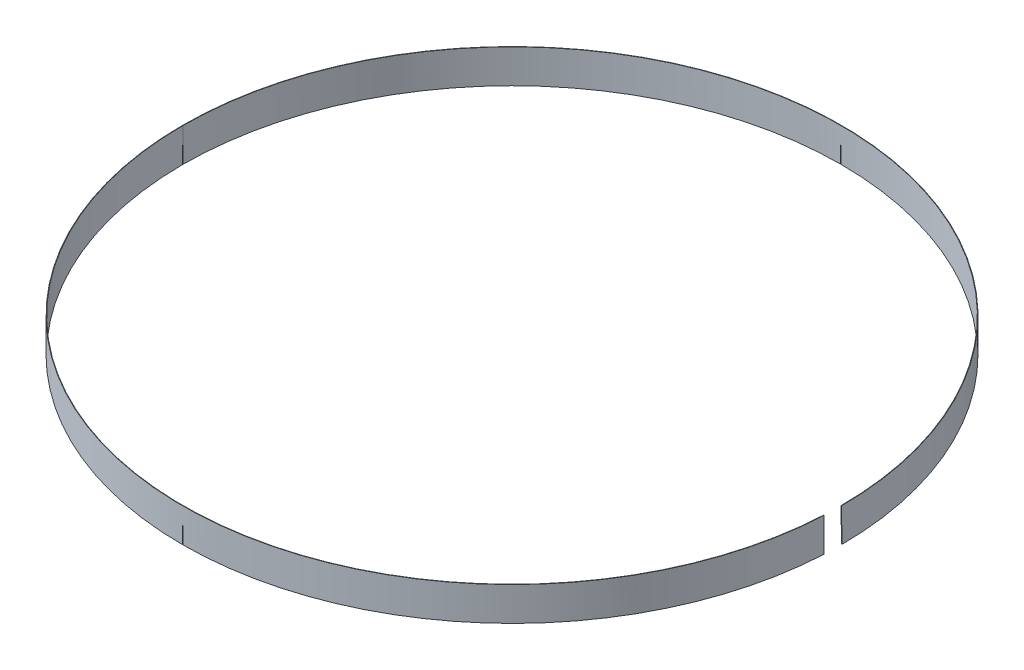
ISO-10303-21;
HEADER;
FILE_DESCRIPTION(('STEP AP214'),'2;1');
FILE_NAME('part.step','',(''),(''),'','','');
FILE_SCHEMA(('AUTOMOTIVE_DESIGN { 1 0 10303 214 1 1 1 1 }'));
ENDSEC;
DATA;
#1=APPLICATION_CONTEXT('core data for automotive mechanical design processes');
#2=APPLICATION_PROTOCOL_DEFINITION('international standard','automotive_design',2000,#1);
#3=PRODUCT_CONTEXT('',#1,'mechanical');
#4=PRODUCT('Part','Part','',(#3));
#5=PRODUCT_RELATED_PRODUCT_CATEGORY('part','',(#4));
#6=PRODUCT_DEFINITION_FORMATION('','',#4);
#7=PRODUCT_DEFINITION_CONTEXT('part definition',#1,'design');
#8=PRODUCT_DEFINITION('design','',#6,#7);
#9=PRODUCT_DEFINITION_SHAPE('','',#8);
#10=(LENGTH_UNIT() NAMED_UNIT(*) SI_UNIT(.MILLI.,.METRE.));
#11=(NAMED_UNIT(*) PLANE_ANGLE_UNIT() SI_UNIT($,.RADIAN.));
#12=(NAMED_UNIT(*) SI_UNIT($,.STERADIAN.) SOLID_ANGLE_UNIT());
#13=UNCERTAINTY_MEASURE_WITH_UNIT(LENGTH_MEASURE(1.E-05),#10,'distance_accuracy_value','');
#14=(GEOMETRIC_REPRESENTATION_CONTEXT(3) GLOBAL_UNCERTAINTY_ASSIGNED_CONTEXT((#13)) GLOBAL_UNIT_ASSIGNED_CONTEXT((#10,
#11,#12)) REPRESENTATION_CONTEXT('',''));
#15=CARTESIAN_POINT('',(0.,0.,0.));
#16=DIRECTION('',(0.,0.,1.));
#17=DIRECTION('',(1.,0.,0.));
#18=AXIS2_PLACEMENT_3D('',#15,#16,#17);
#19=CARTESIAN_POINT('',(195.5,15.,0.));
#20=DIRECTION('',(0.,0.,-1.));
#21=DIRECTION('',(0.,1.,0.));
#22=AXIS2_PLACEMENT_3D('',#19,#20,#21);
#23=PLANE('',#22);
#24=DIRECTION('',(-1.,0.,0.));
#25=VECTOR('',#24,1.);
#26=CARTESIAN_POINT('',(195.5,10.,0.));
#27=LINE('',#26,#25);
#28=CARTESIAN_POINT('',(195.75,10.,0.));
#29=VERTEX_POINT('',#28);
#30=CARTESIAN_POINT('',(195.5,10.,0.));
#31=VERTEX_POINT('',#30);
#32=EDGE_CURVE('E109',#29,#31,#27,.T.);
#33=ORIENTED_EDGE('',*,*,#32,.F.);
#34=DIRECTION('',(0.,-1.,0.));
#35=VECTOR('',#34,1.);
#36=CARTESIAN_POINT('',(195.75,629.899456202727,0.));
#37=LINE('',#36,#35);
#38=CARTESIAN_POINT('',(195.75,20.,0.));
#39=VERTEX_POINT('',#38);
#40=EDGE_CURVE('E284',#29,#39,#37,.F.);
#41=ORIENTED_EDGE('',*,*,#40,.T.);
#42=DIRECTION('',(-1.,0.,0.));
#43=VECTOR('',#42,1.);
#44=CARTESIAN_POINT('',(195.5,20.,0.));
#45=LINE('',#44,#43);
#46=CARTESIAN_POINT('',(195.5,20.,0.));
#47=VERTEX_POINT('',#46);
#48=EDGE_CURVE('E59',#39,#47,#45,.T.);
#49=ORIENTED_EDGE('',*,*,#48,.T.);
#50=DIRECTION('',(0.,1.,0.));
#51=VECTOR('',#50,1.);
#52=CARTESIAN_POINT('',(195.5,10.,0.));
#53=LINE('',#52,#51);
#54=EDGE_CURVE('E234',#31,#47,#53,.T.);
#55=ORIENTED_EDGE('',*,*,#54,.F.);
#56=EDGE_LOOP('',(#33,#41,#49,#55));
#57=FACE_BOUND('',#56,.T.);
#58=ADVANCED_FACE('F40',(#57),#23,.F.);
#59=CARTESIAN_POINT('',(0.,10.,0.));
#60=DIRECTION('',(0.,1.,0.));
#61=DIRECTION('',(0.,0.,1.));
#62=AXIS2_PLACEMENT_3D('',#59,#60,#61);
#63=PLANE('',#62);
#64=DIRECTION('',(-0.999998824118064,0.,0.00153354572478864));
#65=VECTOR('',#64,1.);
#66=CARTESIAN_POINT('',(195.499770115081,10.,-0.299808189196199));
#67=LINE('',#66,#65);
#68=CARTESIAN_POINT('',(195.749769821111,10.,-0.300191575627417));
#69=VERTEX_POINT('',#68);
#70=CARTESIAN_POINT('',(195.499770115081,10.,-0.299808189196199));
#71=VERTEX_POINT('',#70);
#72=EDGE_CURVE('E275',#69,#71,#67,.T.);
#73=ORIENTED_EDGE('',*,*,#72,.F.);
#74=CARTESIAN_POINT('',(0.,10.,0.));
#75=DIRECTION('',(0.,-1.,0.));
#76=DIRECTION('',(0.,0.,-1.));
#77=AXIS2_PLACEMENT_3D('',#74,#75,#76);
#78=CIRCLE('',#77,195.75);
#79=EDGE_CURVE('E281',#69,#29,#78,.T.);
#80=ORIENTED_EDGE('',*,*,#79,.T.);
#81=ORIENTED_EDGE('',*,*,#32,.T.);
#82=CARTESIAN_POINT('',(0.,10.,0.));
#83=DIRECTION('',(0.,-1.,0.));
#84=DIRECTION('',(0.,0.,-1.));
#85=AXIS2_PLACEMENT_3D('',#82,#83,#84);
#86=CIRCLE('',#85,195.5);
#87=EDGE_CURVE('E237',#71,#31,#86,.T.);
#88=ORIENTED_EDGE('',*,*,#87,.F.);
#89=EDGE_LOOP('',(#73,#80,#81,#88));
#90=FACE_BOUND('',#89,.T.);
#91=ADVANCED_FACE('F404',(#90),#63,.F.);
#92=CARTESIAN_POINT('',(195.499770115081,5.,-0.299808189196201));
#93=DIRECTION('',(-0.00153354572478865,0.,-0.999998824118064));
#94=DIRECTION('',(0.,1.,0.));
#95=AXIS2_PLACEMENT_3D('',#92,#93,#94);
#96=PLANE('',#95);
#97=DIRECTION('',(-0.999998824118064,0.,0.00153354572478919));
#98=VECTOR('',#97,1.);
#99=CARTESIAN_POINT('',(195.499770115081,0.,-0.299808189196307));
#100=LINE('',#99,#98);
#101=CARTESIAN_POINT('',(195.749769821111,0.,-0.300191575627417));
#102=VERTEX_POINT('',#101);
#103=CARTESIAN_POINT('',(195.499770115081,0.,-0.299808189196307));
#104=VERTEX_POINT('',#103);
#105=EDGE_CURVE('E270',#102,#104,#100,.T.);
#106=ORIENTED_EDGE('',*,*,#105,.F.);
#107=DIRECTION('',(0.,-1.,0.));
#108=VECTOR('',#107,1.);
#109=CARTESIAN_POINT('',(195.749769821111,629.899456202727,-0.300191575627417));
#110=LINE('',#109,#108);
#111=EDGE_CURVE('E277',#102,#69,#110,.F.);
#112=ORIENTED_EDGE('',*,*,#111,.T.);
#113=ORIENTED_EDGE('',*,*,#72,.T.);
#114=DIRECTION('',(0.,1.,0.));
#115=VECTOR('',#114,1.);
#116=CARTESIAN_POINT('',(195.499770115081,0.,-0.299808189196203));
#117=LINE('',#116,#115);
#118=EDGE_CURVE('E240',#104,#71,#117,.T.);
#119=ORIENTED_EDGE('',*,*,#118,.F.);
#120=EDGE_LOOP('',(#106,#112,#113,#119));
#121=FACE_BOUND('',#120,.T.);
#122=ADVANCED_FACE('F409',(#121),#96,.F.);
#123=CARTESIAN_POINT('',(0.,0.,0.));
#124=DIRECTION('',(0.,1.,0.));
#125=DIRECTION('',(0.,0.,1.));
#126=AXIS2_PLACEMENT_3D('',#123,#124,#125);
#127=PLANE('',#126);
#128=DIRECTION('',(1.51748025478114E-05,0.,0.999999999884863));
#129=VECTOR('',#128,1.);
#130=CARTESIAN_POINT('',(-0.00296667389809713,0.,-195.499999977491));
#131=LINE('',#130,#129);
#132=CARTESIAN_POINT('',(-0.002970467598853,0.,-195.749999977462));
#133=VERTEX_POINT('',#132);
#134=CARTESIAN_POINT('',(-0.00296667389809713,0.,-195.499999977491));
#135=VERTEX_POINT('',#134);
#136=EDGE_CURVE('E265',#133,#135,#131,.T.);
#137=ORIENTED_EDGE('',*,*,#136,.F.);
#138=CARTESIAN_POINT('',(0.,0.,0.));
#139=DIRECTION('',(0.,-1.,0.));
#140=DIRECTION('',(0.,0.,-1.));
#141=AXIS2_PLACEMENT_3D('',#138,#139,#140);
#142=CIRCLE('',#141,195.75);
#143=EDGE_CURVE('E272',#133,#102,#142,.T.);
#144=ORIENTED_EDGE('',*,*,#143,.T.);
#145=ORIENTED_EDGE('',*,*,#105,.T.);
#146=CARTESIAN_POINT('',(0.,0.,0.));
#147=DIRECTION('',(0.,-1.,0.));
#148=DIRECTION('',(0.,0.,-1.));
#149=AXIS2_PLACEMENT_3D('',#146,#147,#148);
#150=CIRCLE('',#149,195.5);
#151=EDGE_CURVE('E243',#135,#104,#150,.T.);
#152=ORIENTED_EDGE('',*,*,#151,.F.);
#153=EDGE_LOOP('',(#137,#144,#145,#152));
#154=FACE_BOUND('',#153,.T.);
#155=ADVANCED_FACE('F416',(#154),#127,.F.);
#156=CARTESIAN_POINT('',(-0.00296667389809713,5.,-195.499999977491));
#157=DIRECTION('',(0.999999999884863,0.,-1.51748025478114E-05));
#158=DIRECTION('',(0.,-1.,0.));
#159=AXIS2_PLACEMENT_3D('',#156,#157,#158);
#160=PLANE('',#159);
#161=DIRECTION('',(1.51748025478114E-05,0.,0.999999999884863));
#162=VECTOR('',#161,1.);
#163=CARTESIAN_POINT('',(-0.00296667389809713,10.,-195.499999977491));
#164=LINE('',#163,#162);
#165=CARTESIAN_POINT('',(-0.002970467598853,10.,-195.749999977462));
#166=VERTEX_POINT('',#165);
#167=CARTESIAN_POINT('',(-0.00296667389809713,10.,-195.499999977491));
#168=VERTEX_POINT('',#167);
#169=EDGE_CURVE('E260',#166,#168,#164,.T.);
#170=ORIENTED_EDGE('',*,*,#169,.F.);
#171=DIRECTION('',(0.,-1.,0.));
#172=VECTOR('',#171,1.);
#173=CARTESIAN_POINT('',(-0.002970467598853,629.899456202727,-195.749999977462));
#174=LINE('',#173,#172);
#175=EDGE_CURVE('E267',#166,#133,#174,.T.);
#176=ORIENTED_EDGE('',*,*,#175,.T.);
#177=ORIENTED_EDGE('',*,*,#136,.T.);
#178=DIRECTION('',(0.,-1.,0.));
#179=VECTOR('',#178,1.);
#180=CARTESIAN_POINT('',(-0.00296667389809713,10.,-195.499999977491));
#181=LINE('',#180,#179);
#182=EDGE_CURVE('E246',#168,#135,#181,.T.);
#183=ORIENTED_EDGE('',*,*,#182,.F.);
#184=EDGE_LOOP('',(#170,#176,#177,#183));
#185=FACE_BOUND('',#184,.T.);
#186=ADVANCED_FACE('F420',(#185),#160,.F.);
#187=CARTESIAN_POINT('',(0.,10.,0.));
#188=DIRECTION('',(0.,1.,0.));
#189=DIRECTION('',(0.,0.,1.));
#190=AXIS2_PLACEMENT_3D('',#187,#188,#189);
#191=PLANE('',#190);
#192=CARTESIAN_POINT('',(0.,10.,0.));
#193=DIRECTION('',(0.,-1.,0.));
#194=DIRECTION('',(0.,0.,-1.));
#195=AXIS2_PLACEMENT_3D('',#192,#193,#194);
#196=CIRCLE('',#195,195.75);
#197=CARTESIAN_POINT('',(-0.303162039698669,10.,-195.749765243225));
#198=VERTEX_POINT('',#197);
#199=EDGE_CURVE('E262',#198,#166,#196,.T.);
#200=ORIENTED_EDGE('',*,*,#199,.T.);
#201=ORIENTED_EDGE('',*,*,#169,.T.);
#202=CARTESIAN_POINT('',(0.,10.,0.));
#203=DIRECTION('',(0.,-1.,0.));
#204=DIRECTION('',(0.,0.,-1.));
#205=AXIS2_PLACEMENT_3D('',#202,#203,#204);
#206=CIRCLE('',#205,195.5);
#207=CARTESIAN_POINT('',(-0.302774859571364,10.,-195.499765543042));
#208=VERTEX_POINT('',#207);
#209=EDGE_CURVE('E249',#208,#168,#206,.T.);
#210=ORIENTED_EDGE('',*,*,#209,.F.);
#211=DIRECTION('',(0.00154872050931644,0.,0.999998800731673));
#212=VECTOR('',#211,1.);
#213=CARTESIAN_POINT('',(-0.302774859571364,10.,-195.499765543042));
#214=LINE('',#213,#212);
#215=EDGE_CURVE('E255',#198,#208,#214,.T.);
#216=ORIENTED_EDGE('',*,*,#215,.F.);
#217=EDGE_LOOP('',(#200,#201,#210,#216));
#218=FACE_BOUND('',#217,.T.);
#219=ADVANCED_FACE('F424',(#218),#191,.F.);
#220=CARTESIAN_POINT('',(-0.302774859571364,5.,-195.499765543042));
#221=DIRECTION('',(-0.999998800731673,0.,0.00154872050931644));
#222=DIRECTION('',(0.,1.,0.));
#223=AXIS2_PLACEMENT_3D('',#220,#221,#222);
#224=PLANE('',#223);
#225=DIRECTION('',(0.00154872050931632,0.,0.999998800731673));
#226=VECTOR('',#225,1.);
#227=CARTESIAN_POINT('',(-0.30277485957134,0.,-195.499765543042));
#228=LINE('',#227,#226);
#229=CARTESIAN_POINT('',(-0.303162039698669,0.,-195.749765243225));
#230=VERTEX_POINT('',#229);
#231=CARTESIAN_POINT('',(-0.30277485957134,0.,-195.499765543042));
#232=VERTEX_POINT('',#231);
#233=EDGE_CURVE('E217',#230,#232,#228,.T.);
#234=ORIENTED_EDGE('',*,*,#233,.F.);
#235=DIRECTION('',(0.,-1.,0.));
#236=VECTOR('',#235,1.);
#237=CARTESIAN_POINT('',(-0.303162039698669,629.899456202727,-195.749765243225));
#238=LINE('',#237,#236);
#239=EDGE_CURVE('E257',#230,#198,#238,.F.);
#240=ORIENTED_EDGE('',*,*,#239,.T.);
#241=ORIENTED_EDGE('',*,*,#215,.T.);
#242=DIRECTION('',(0.,1.,0.));
#243=VECTOR('',#242,1.);
#244=CARTESIAN_POINT('',(-0.302774859571364,0.,-195.499765543042));
#245=LINE('',#244,#243);
#246=EDGE_CURVE('E252',#232,#208,#245,.T.);
#247=ORIENTED_EDGE('',*,*,#246,.F.);
#248=EDGE_LOOP('',(#234,#240,#241,#247));
#249=FACE_BOUND('',#248,.T.);
#250=ADVANCED_FACE('F428',(#249),#224,.F.);
#251=CARTESIAN_POINT('',(0.,629.899456202727,0.));
#252=DIRECTION('',(0.,-1.,0.));
#253=DIRECTION('',(0.,0.,-1.));
#254=AXIS2_PLACEMENT_3D('',#251,#252,#253);
#255=CYLINDRICAL_SURFACE('',#254,195.5);
#256=ORIENTED_EDGE('',*,*,#246,.T.);
#257=ORIENTED_EDGE('',*,*,#209,.T.);
#258=ORIENTED_EDGE('',*,*,#182,.T.);
#259=ORIENTED_EDGE('',*,*,#151,.T.);
#260=ORIENTED_EDGE('',*,*,#118,.T.);
#261=ORIENTED_EDGE('',*,*,#87,.T.);
#262=ORIENTED_EDGE('',*,*,#54,.T.);
#263=CARTESIAN_POINT('',(0.,20.,0.));
#264=DIRECTION('',(0.,1.,0.));
#265=DIRECTION('',(0.,0.,1.));
#266=AXIS2_PLACEMENT_3D('',#263,#264,#265);
#267=CIRCLE('',#266,195.5);
#268=CARTESIAN_POINT('',(-195.5,20.0000000000002,1.33188500793896E-12));
#269=VERTEX_POINT('',#268);
#270=EDGE_CURVE('E231',#47,#269,#267,.T.);
#271=ORIENTED_EDGE('',*,*,#270,.T.);
#272=DIRECTION('',(0.,-1.,0.));
#273=VECTOR('',#272,1.);
#274=CARTESIAN_POINT('',(-195.5,20.,-2.99760216648792E-12));
#275=LINE('',#274,#273);
#276=CARTESIAN_POINT('',(-195.5,2.22044604925031E-13,-1.52917109022532E-12));
#277=VERTEX_POINT('',#276);
#278=EDGE_CURVE('E228',#269,#277,#275,.T.);
#279=ORIENTED_EDGE('',*,*,#278,.T.);
#280=CARTESIAN_POINT('',(0.,0.,0.));
#281=DIRECTION('',(0.,-1.,0.));
#282=DIRECTION('',(0.,0.,-1.));
#283=AXIS2_PLACEMENT_3D('',#280,#281,#282);
#284=CIRCLE('',#283,195.5);
#285=EDGE_CURVE('E225',#277,#232,#284,.T.);
#286=ORIENTED_EDGE('',*,*,#285,.T.);
#287=EDGE_LOOP('',(#256,#257,#258,#259,#260,#261,#262,#271,#279,#286));
#288=FACE_BOUND('',#287,.T.);
#289=ADVANCED_FACE('F313',(#288),#255,.F.);
#290=CARTESIAN_POINT('',(0.,0.,0.));
#291=DIRECTION('',(0.,1.,0.));
#292=DIRECTION('',(0.,0.,1.));
#293=AXIS2_PLACEMENT_3D('',#290,#291,#292);
#294=PLANE('',#293);
#295=DIRECTION('',(-1.,0.,-1.40859772734376E-13));
#296=VECTOR('',#295,1.);
#297=CARTESIAN_POINT('',(-195.5,0.,-2.99760216648792E-12));
#298=LINE('',#297,#296);
#299=CARTESIAN_POINT('',(-195.75,0.,-2.99760216648792E-12));
#300=VERTEX_POINT('',#299);
#301=EDGE_CURVE('E222',#277,#300,#298,.T.);
#302=ORIENTED_EDGE('',*,*,#301,.T.);
#303=CARTESIAN_POINT('',(0.,0.,0.));
#304=DIRECTION('',(0.,-1.,0.));
#305=DIRECTION('',(0.,0.,-1.));
#306=AXIS2_PLACEMENT_3D('',#303,#304,#305);
#307=CIRCLE('',#306,195.75);
#308=EDGE_CURVE('E219',#300,#230,#307,.T.);
#309=ORIENTED_EDGE('',*,*,#308,.T.);
#310=ORIENTED_EDGE('',*,*,#233,.T.);
#311=ORIENTED_EDGE('',*,*,#285,.F.);
#312=EDGE_LOOP('',(#302,#309,#310,#311));
#313=FACE_BOUND('',#312,.T.);
#314=ADVANCED_FACE('F297',(#313),#294,.F.);
#315=CARTESIAN_POINT('',(0.,629.899456202727,0.));
#316=DIRECTION('',(0.,-1.,0.));
#317=DIRECTION('',(0.,0.,-1.));
#318=AXIS2_PLACEMENT_3D('',#315,#316,#317);
#319=CYLINDRICAL_SURFACE('',#318,195.75);
#320=ORIENTED_EDGE('',*,*,#239,.F.);
#321=ORIENTED_EDGE('',*,*,#308,.F.);
#322=DIRECTION('',(0.,-1.,0.));
#323=VECTOR('',#322,1.);
#324=CARTESIAN_POINT('',(-195.75,20.,-2.99760216648792E-12));
#325=LINE('',#324,#323);
#326=CARTESIAN_POINT('',(-195.75,20.0000000000006,-1.24492828393445E-13));
#327=VERTEX_POINT('',#326);
#328=EDGE_CURVE('E44',#327,#300,#325,.T.);
#329=ORIENTED_EDGE('',*,*,#328,.F.);
#330=CARTESIAN_POINT('',(0.,20.,0.));
#331=DIRECTION('',(0.,-1.,0.));
#332=DIRECTION('',(0.,0.,-1.));
#333=AXIS2_PLACEMENT_3D('',#330,#331,#332);
#334=CIRCLE('',#333,195.75);
#335=EDGE_CURVE('E50',#39,#327,#334,.F.);
#336=ORIENTED_EDGE('',*,*,#335,.F.);
#337=ORIENTED_EDGE('',*,*,#40,.F.);
#338=ORIENTED_EDGE('',*,*,#79,.F.);
#339=ORIENTED_EDGE('',*,*,#111,.F.);
#340=ORIENTED_EDGE('',*,*,#143,.F.);
#341=ORIENTED_EDGE('',*,*,#175,.F.);
#342=ORIENTED_EDGE('',*,*,#199,.F.);
#343=EDGE_LOOP('',(#320,#321,#329,#336,#337,#338,#339,#340,#341,#342));
#344=FACE_BOUND('',#343,.T.);
#345=ADVANCED_FACE('F293',(#344),#319,.T.);
#346=CARTESIAN_POINT('',(0.,20.,0.));
#347=DIRECTION('',(0.,-1.,0.));
#348=DIRECTION('',(0.,0.,-1.));
#349=AXIS2_PLACEMENT_3D('',#346,#347,#348);
#350=PLANE('',#349);
#351=ORIENTED_EDGE('',*,*,#48,.F.);
#352=ORIENTED_EDGE('',*,*,#335,.T.);
#353=DIRECTION('',(1.,0.,1.40859772734376E-13));
#354=VECTOR('',#353,1.);
#355=CARTESIAN_POINT('',(-195.75,20.,-2.99760216648792E-12));
#356=LINE('',#355,#354);
#357=EDGE_CURVE('E11',#327,#269,#356,.T.);
#358=ORIENTED_EDGE('',*,*,#357,.T.);
#359=ORIENTED_EDGE('',*,*,#270,.F.);
#360=EDGE_LOOP('',(#351,#352,#358,#359));
#361=FACE_BOUND('',#360,.T.);
#362=ADVANCED_FACE('F42',(#361),#350,.F.);
#363=CARTESIAN_POINT('',(-195.499999909962,5.00000000000023,0.00593334778587486));
#364=DIRECTION('',(-3.03496558970763E-05,0.,-0.999999999539449));
#365=DIRECTION('',(0.,-1.,0.));
#366=AXIS2_PLACEMENT_3D('',#363,#364,#365);
#367=PLANE('',#366);
#368=DIRECTION('',(0.999999999539449,0.,-3.03496558970763E-05));
#369=VECTOR('',#368,1.);
#370=CARTESIAN_POINT('',(-195.499999909962,10.0000000000002,0.00593334778587486));
#371=LINE('',#370,#369);
#372=CARTESIAN_POINT('',(-195.749999909847,10.0000000000006,0.00594093519980344));
#373=VERTEX_POINT('',#372);
#374=CARTESIAN_POINT('',(-195.499999909962,10.0000000000002,0.00593334778587486));
#375=VERTEX_POINT('',#374);
#376=EDGE_CURVE('E164',#373,#375,#371,.T.);
#377=ORIENTED_EDGE('',*,*,#376,.F.);
#378=DIRECTION('',(0.,-1.,0.));
#379=VECTOR('',#378,1.);
#380=CARTESIAN_POINT('',(-195.749999909847,614.905873017348,0.00594093519980344));
#381=LINE('',#380,#379);
#382=CARTESIAN_POINT('',(-195.749999909847,5.55111512312578E-13,0.00594093519980344));
#383=VERTEX_POINT('',#382);
#384=EDGE_CURVE('E168',#373,#383,#381,.T.);
#385=ORIENTED_EDGE('',*,*,#384,.T.);
#386=DIRECTION('',(0.999999999539449,0.,-3.03496558970763E-05));
#387=VECTOR('',#386,1.);
#388=CARTESIAN_POINT('',(-195.499999909962,2.22044604925031E-13,0.00593334778587486));
#389=LINE('',#388,#387);
#390=CARTESIAN_POINT('',(-195.499999909962,2.22044604925031E-13,0.00593334778587486));
#391=VERTEX_POINT('',#390);
#392=EDGE_CURVE('E176',#383,#391,#389,.T.);
#393=ORIENTED_EDGE('',*,*,#392,.T.);
#394=DIRECTION('',(0.,-1.,0.));
#395=VECTOR('',#394,1.);
#396=CARTESIAN_POINT('',(-195.499999909962,10.0000000000002,0.00593334778587486));
#397=LINE('',#396,#395);
#398=EDGE_CURVE('E171',#375,#391,#397,.T.);
#399=ORIENTED_EDGE('',*,*,#398,.F.);
#400=EDGE_LOOP('',(#377,#385,#393,#399));
#401=FACE_BOUND('',#400,.T.);
#402=ADVANCED_FACE('F166',(#401),#367,.F.);
#403=CARTESIAN_POINT('',(-0.000327485140561024,2.22044604925031E-13,-2.9422216165324E-12));
#404=DIRECTION('',(0.,1.,0.));
#405=DIRECTION('',(-1.,0.,0.));
#406=AXIS2_PLACEMENT_3D('',#403,#404,#405);
#407=PLANE('',#406);
#408=ORIENTED_EDGE('',*,*,#392,.F.);
#409=CARTESIAN_POINT('',(-0.000327485140561024,4.44089209850063E-13,-2.9422216165324E-12));
#410=DIRECTION('',(0.,-1.,0.));
#411=DIRECTION('',(0.,0.,-1.));
#412=AXIS2_PLACEMENT_3D('',#409,#410,#411);
#413=CIRCLE('',#412,195.749672514859);
#414=EDGE_CURVE('E117',#383,#300,#413,.T.);
#415=ORIENTED_EDGE('',*,*,#414,.T.);
#416=ORIENTED_EDGE('',*,*,#301,.F.);
#417=CARTESIAN_POINT('',(-0.000327485140561024,2.22044604925031E-13,-2.9422216165324E-12));
#418=DIRECTION('',(0.,-1.,0.));
#419=DIRECTION('',(1.,0.,0.));
#420=AXIS2_PLACEMENT_3D('',#417,#418,#419);
#421=CIRCLE('',#420,195.499672514859);
#422=EDGE_CURVE('E187',#391,#277,#421,.T.);
#423=ORIENTED_EDGE('',*,*,#422,.F.);
#424=EDGE_LOOP('',(#408,#415,#416,#423));
#425=FACE_BOUND('',#424,.T.);
#426=ADVANCED_FACE('F301',(#425),#407,.F.);
#427=CARTESIAN_POINT('',(-0.000327485140561024,20.0000000000002,-2.9422216165324E-12));
#428=DIRECTION('',(0.,-1.,0.));
#429=DIRECTION('',(0.,0.,-1.));
#430=AXIS2_PLACEMENT_3D('',#427,#428,#429);
#431=PLANE('',#430);
#432=ORIENTED_EDGE('',*,*,#357,.F.);
#433=CARTESIAN_POINT('',(-0.000327485140561024,20.0000000000005,-2.9422216165324E-12));
#434=DIRECTION('',(0.,-1.,0.));
#435=DIRECTION('',(0.,0.,-1.));
#436=AXIS2_PLACEMENT_3D('',#433,#434,#435);
#437=CIRCLE('',#436,195.749672514859);
#438=CARTESIAN_POINT('',(195.493751586232,20.0000000000006,9.99996688547787));
#439=VERTEX_POINT('',#438);
#440=EDGE_CURVE('E290',#327,#439,#437,.F.);
#441=ORIENTED_EDGE('',*,*,#440,.T.);
#442=DIRECTION('',(-0.99869428418345,0.,-0.0510854846243576));
#443=VECTOR('',#442,1.);
#444=CARTESIAN_POINT('',(195.244078015186,20.0000000000002,9.98719551432185));
#445=LINE('',#444,#443);
#446=CARTESIAN_POINT('',(195.244078015186,20.0000000000002,9.98719551432185));
#447=VERTEX_POINT('',#446);
#448=EDGE_CURVE('E210',#439,#447,#445,.T.);
#449=ORIENTED_EDGE('',*,*,#448,.T.);
#450=CARTESIAN_POINT('',(-0.000327485140561024,20.0000000000002,-2.9422216165324E-12));
#451=DIRECTION('',(0.,1.,0.));
#452=DIRECTION('',(0.,0.,1.));
#453=AXIS2_PLACEMENT_3D('',#450,#451,#452);
#454=CIRCLE('',#453,195.499672514859);
#455=EDGE_CURVE('E310',#269,#447,#454,.T.);
#456=ORIENTED_EDGE('',*,*,#455,.F.);
#457=EDGE_LOOP('',(#432,#441,#449,#456));
#458=FACE_BOUND('',#457,.T.);
#459=ADVANCED_FACE('F318',(#458),#431,.F.);
#460=CARTESIAN_POINT('',(195.244078015186,10.0000000000002,9.9871955143218));
#461=DIRECTION('',(-0.0510854846243573,0.,0.99869428418345));
#462=DIRECTION('',(0.,-1.,0.));
#463=AXIS2_PLACEMENT_3D('',#460,#461,#462);
#464=PLANE('',#463);
#465=ORIENTED_EDGE('',*,*,#448,.F.);
#466=DIRECTION('',(0.,-1.,0.));
#467=VECTOR('',#466,1.);
#468=CARTESIAN_POINT('',(195.493751586232,614.905873017348,9.99996688547787));
#469=LINE('',#468,#467);
#470=CARTESIAN_POINT('',(195.493751586232,5.55111512312578E-13,9.99996688547787));
#471=VERTEX_POINT('',#470);
#472=EDGE_CURVE('E357',#439,#471,#469,.T.);
#473=ORIENTED_EDGE('',*,*,#472,.T.);
#474=DIRECTION('',(-0.99869428418345,0.,-0.0510854846243573));
#475=VECTOR('',#474,1.);
#476=CARTESIAN_POINT('',(195.244078015186,2.22044604925031E-13,9.9871955143218));
#477=LINE('',#476,#475);
#478=CARTESIAN_POINT('',(195.244078015186,2.22044604925031E-13,9.9871955143218));
#479=VERTEX_POINT('',#478);
#480=EDGE_CURVE('E207',#471,#479,#477,.T.);
#481=ORIENTED_EDGE('',*,*,#480,.T.);
#482=DIRECTION('',(0.,-1.,0.));
#483=VECTOR('',#482,1.);
#484=CARTESIAN_POINT('',(195.244078015186,20.0000000000002,9.9871955143218));
#485=LINE('',#484,#483);
#486=EDGE_CURVE('E321',#447,#479,#485,.T.);
#487=ORIENTED_EDGE('',*,*,#486,.F.);
#488=EDGE_LOOP('',(#465,#473,#481,#487));
#489=FACE_BOUND('',#488,.T.);
#490=ADVANCED_FACE('F361',(#489),#464,.F.);
#491=CARTESIAN_POINT('',(-0.000327485140561024,2.22044604925031E-13,-2.9422216165324E-12));
#492=DIRECTION('',(0.,1.,0.));
#493=DIRECTION('',(-1.,0.,0.));
#494=AXIS2_PLACEMENT_3D('',#491,#492,#493);
#495=PLANE('',#494);
#496=ORIENTED_EDGE('',*,*,#480,.F.);
#497=CARTESIAN_POINT('',(-0.000327485140561024,4.44089209850063E-13,-2.9422216165324E-12));
#498=DIRECTION('',(0.,-1.,0.));
#499=DIRECTION('',(0.,0.,-1.));
#500=AXIS2_PLACEMENT_3D('',#497,#498,#499);
#501=CIRCLE('',#500,195.749672514859);
#502=CARTESIAN_POINT('',(0.309290223330075,5.55111512312578E-13,195.749427653182));
#503=VERTEX_POINT('',#502);
#504=EDGE_CURVE('E354',#471,#503,#501,.T.);
#505=ORIENTED_EDGE('',*,*,#504,.T.);
#506=DIRECTION('',(-0.00158170230628162,0.,-0.999998749108125));
#507=VECTOR('',#506,1.);
#508=CARTESIAN_POINT('',(0.308894797753493,2.22044604925031E-13,195.499427965905));
#509=LINE('',#508,#507);
#510=CARTESIAN_POINT('',(0.308894797753493,2.22044604925031E-13,195.499427965905));
#511=VERTEX_POINT('',#510);
#512=EDGE_CURVE('E204',#503,#511,#509,.T.);
#513=ORIENTED_EDGE('',*,*,#512,.T.);
#514=CARTESIAN_POINT('',(-0.000327485140561024,2.22044604925031E-13,-2.9422216165324E-12));
#515=DIRECTION('',(0.,-1.,0.));
#516=DIRECTION('',(1.,0.,0.));
#517=AXIS2_PLACEMENT_3D('',#514,#515,#516);
#518=CIRCLE('',#517,195.499672514859);
#519=EDGE_CURVE('E323',#479,#511,#518,.T.);
#520=ORIENTED_EDGE('',*,*,#519,.F.);
#521=EDGE_LOOP('',(#496,#505,#513,#520));
#522=FACE_BOUND('',#521,.T.);
#523=ADVANCED_FACE('F367',(#522),#495,.F.);
#524=CARTESIAN_POINT('',(0.308894797753476,5.00000000000023,195.499427965905));
#525=DIRECTION('',(0.999998749108125,0.,-0.00158170230628153));
#526=DIRECTION('',(0.,1.,0.));
#527=AXIS2_PLACEMENT_3D('',#524,#525,#526);
#528=PLANE('',#527);
#529=ORIENTED_EDGE('',*,*,#512,.F.);
#530=DIRECTION('',(0.,-1.,0.));
#531=VECTOR('',#530,1.);
#532=CARTESIAN_POINT('',(0.309290223330075,614.905873017348,195.749427653182));
#533=LINE('',#532,#531);
#534=CARTESIAN_POINT('',(0.309290223330075,10.0000000000006,195.749427653182));
#535=VERTEX_POINT('',#534);
#536=EDGE_CURVE('E351',#503,#535,#533,.F.);
#537=ORIENTED_EDGE('',*,*,#536,.T.);
#538=DIRECTION('',(-0.00158170230628153,0.,-0.999998749108125));
#539=VECTOR('',#538,1.);
#540=CARTESIAN_POINT('',(0.308894797753476,10.0000000000002,195.499427965905));
#541=LINE('',#540,#539);
#542=CARTESIAN_POINT('',(0.308894797753476,10.0000000000002,195.499427965905));
#543=VERTEX_POINT('',#542);
#544=EDGE_CURVE('E201',#535,#543,#541,.T.);
#545=ORIENTED_EDGE('',*,*,#544,.T.);
#546=DIRECTION('',(0.,1.,0.));
#547=VECTOR('',#546,1.);
#548=CARTESIAN_POINT('',(0.308894797753476,2.22044604925031E-13,195.499427965905));
#549=LINE('',#548,#547);
#550=EDGE_CURVE('E328',#511,#543,#549,.T.);
#551=ORIENTED_EDGE('',*,*,#550,.F.);
#552=EDGE_LOOP('',(#529,#537,#545,#551));
#553=FACE_BOUND('',#552,.T.);
#554=ADVANCED_FACE('F376',(#553),#528,.F.);
#555=CARTESIAN_POINT('',(-0.000327485140561024,10.0000000000002,-2.9422216165324E-12));
#556=DIRECTION('',(0.,1.,0.));
#557=DIRECTION('',(0.,0.,1.));
#558=AXIS2_PLACEMENT_3D('',#555,#556,#557);
#559=PLANE('',#558);
#560=ORIENTED_EDGE('',*,*,#544,.F.);
#561=CARTESIAN_POINT('',(-0.000327485140561024,10.0000000000005,-2.9422216165324E-12));
#562=DIRECTION('',(0.,-1.,0.));
#563=DIRECTION('',(0.,0.,-1.));
#564=AXIS2_PLACEMENT_3D('',#561,#562,#563);
#565=CIRCLE('',#564,195.749672514859);
#566=CARTESIAN_POINT('',(0.00909865881431601,10.0000000000006,195.749672287903));
#567=VERTEX_POINT('',#566);
#568=EDGE_CURVE('E348',#535,#567,#565,.T.);
#569=ORIENTED_EDGE('',*,*,#568,.T.);
#570=DIRECTION('',(-4.81540726672812E-05,0.,-0.999999998840593));
#571=VECTOR('',#570,1.);
#572=CARTESIAN_POINT('',(0.00908662029614919,10.0000000000002,195.499672288193));
#573=LINE('',#572,#571);
#574=CARTESIAN_POINT('',(0.00908662029614919,10.0000000000002,195.499672288193));
#575=VERTEX_POINT('',#574);
#576=EDGE_CURVE('E198',#567,#575,#573,.T.);
#577=ORIENTED_EDGE('',*,*,#576,.T.);
#578=CARTESIAN_POINT('',(-0.000327485140561024,10.0000000000002,-2.9422216165324E-12));
#579=DIRECTION('',(0.,-1.,0.));
#580=DIRECTION('',(0.,0.,-1.));
#581=AXIS2_PLACEMENT_3D('',#578,#579,#580);
#582=CIRCLE('',#581,195.499672514859);
#583=EDGE_CURVE('E331',#543,#575,#582,.T.);
#584=ORIENTED_EDGE('',*,*,#583,.F.);
#585=EDGE_LOOP('',(#560,#569,#577,#584));
#586=FACE_BOUND('',#585,.T.);
#587=ADVANCED_FACE('F380',(#586),#559,.F.);
#588=CARTESIAN_POINT('',(0.0090866202961392,5.00000000000023,195.499672288193));
#589=DIRECTION('',(-0.999999998840593,0.,4.81540726672301E-05));
#590=DIRECTION('',(0.,-1.,0.));
#591=AXIS2_PLACEMENT_3D('',#588,#589,#590);
#592=PLANE('',#591);
#593=ORIENTED_EDGE('',*,*,#576,.F.);
#594=DIRECTION('',(0.,-1.,0.));
#595=VECTOR('',#594,1.);
#596=CARTESIAN_POINT('',(0.00909865881431601,614.905873017348,195.749672287903));
#597=LINE('',#596,#595);
#598=CARTESIAN_POINT('',(0.00909865881431601,5.55111512312578E-13,195.749672287903));
#599=VERTEX_POINT('',#598);
#600=EDGE_CURVE('E345',#567,#599,#597,.T.);
#601=ORIENTED_EDGE('',*,*,#600,.T.);
#602=DIRECTION('',(-4.81540726672301E-05,0.,-0.999999998840593));
#603=VECTOR('',#602,1.);
#604=CARTESIAN_POINT('',(0.0090866202961392,2.22044604925031E-13,195.499672288193));
#605=LINE('',#604,#603);
#606=CARTESIAN_POINT('',(0.0090866202961392,2.22044604925031E-13,195.499672288193));
#607=VERTEX_POINT('',#606);
#608=EDGE_CURVE('E195',#599,#607,#605,.T.);
#609=ORIENTED_EDGE('',*,*,#608,.T.);
#610=DIRECTION('',(0.,-1.,0.));
#611=VECTOR('',#610,1.);
#612=CARTESIAN_POINT('',(0.0090866202961392,10.0000000000002,195.499672288193));
#613=LINE('',#612,#611);
#614=EDGE_CURVE('E334',#575,#607,#613,.T.);
#615=ORIENTED_EDGE('',*,*,#614,.F.);
#616=EDGE_LOOP('',(#593,#601,#609,#615));
#617=FACE_BOUND('',#616,.T.);
#618=ADVANCED_FACE('F384',(#617),#592,.F.);
#619=CARTESIAN_POINT('',(-0.000327485140561024,2.22044604925031E-13,-2.9422216165324E-12));
#620=DIRECTION('',(0.,1.,0.));
#621=DIRECTION('',(0.,0.,1.));
#622=AXIS2_PLACEMENT_3D('',#619,#620,#621);
#623=PLANE('',#622);
#624=ORIENTED_EDGE('',*,*,#608,.F.);
#625=CARTESIAN_POINT('',(-0.000327485140561024,4.44089209850063E-13,-2.9422216165324E-12));
#626=DIRECTION('',(0.,-1.,0.));
#627=DIRECTION('',(0.,0.,-1.));
#628=AXIS2_PLACEMENT_3D('',#625,#626,#627);
#629=CIRCLE('',#628,195.749672514859);
#630=CARTESIAN_POINT('',(-195.749760619862,5.55111512312578E-13,0.306132504023561));
#631=VERTEX_POINT('',#630);
#632=EDGE_CURVE('E189',#599,#631,#629,.T.);
#633=ORIENTED_EDGE('',*,*,#632,.T.);
#634=DIRECTION('',(0.999998777110913,0.,-0.00156389791151893));
#635=VECTOR('',#634,1.);
#636=CARTESIAN_POINT('',(-195.499760925584,2.22044604925031E-13,0.305741529545682));
#637=LINE('',#636,#635);
#638=CARTESIAN_POINT('',(-195.499760925584,2.22044604925031E-13,0.305741529545682));
#639=VERTEX_POINT('',#638);
#640=EDGE_CURVE('E193',#631,#639,#637,.T.);
#641=ORIENTED_EDGE('',*,*,#640,.T.);
#642=CARTESIAN_POINT('',(-0.000327485140561024,2.22044604925031E-13,-2.9422216165324E-12));
#643=DIRECTION('',(0.,-1.,0.));
#644=DIRECTION('',(0.,0.,-1.));
#645=AXIS2_PLACEMENT_3D('',#642,#643,#644);
#646=CIRCLE('',#645,195.499672514859);
#647=EDGE_CURVE('E337',#607,#639,#646,.T.);
#648=ORIENTED_EDGE('',*,*,#647,.F.);
#649=EDGE_LOOP('',(#624,#633,#641,#648));
#650=FACE_BOUND('',#649,.T.);
#651=ADVANCED_FACE('F389',(#650),#623,.F.);
#652=CARTESIAN_POINT('',(-195.499760925584,5.00000000000023,0.305741529545726));
#653=DIRECTION('',(0.00156389791151916,0.,0.999998777110913));
#654=DIRECTION('',(0.,1.,0.));
#655=AXIS2_PLACEMENT_3D('',#652,#653,#654);
#656=PLANE('',#655);
#657=ORIENTED_EDGE('',*,*,#640,.F.);
#658=DIRECTION('',(0.,-1.,0.));
#659=VECTOR('',#658,1.);
#660=CARTESIAN_POINT('',(-195.749760619862,614.905873017348,0.306132504023561));
#661=LINE('',#660,#659);
#662=CARTESIAN_POINT('',(-195.749760619862,10.0000000000006,0.306132504023561));
#663=VERTEX_POINT('',#662);
#664=EDGE_CURVE('E185',#631,#663,#661,.F.);
#665=ORIENTED_EDGE('',*,*,#664,.T.);
#666=DIRECTION('',(0.999998777110913,0.,-0.00156389791151916));
#667=VECTOR('',#666,1.);
#668=CARTESIAN_POINT('',(-195.499760925584,10.0000000000002,0.305741529545726));
#669=LINE('',#668,#667);
#670=CARTESIAN_POINT('',(-195.499760925584,10.0000000000002,0.305741529545726));
#671=VERTEX_POINT('',#670);
#672=EDGE_CURVE('E126',#663,#671,#669,.T.);
#673=ORIENTED_EDGE('',*,*,#672,.T.);
#674=DIRECTION('',(0.,1.,0.));
#675=VECTOR('',#674,1.);
#676=CARTESIAN_POINT('',(-195.499760925584,2.22044604925031E-13,0.305741529545726));
#677=LINE('',#676,#675);
#678=EDGE_CURVE('E340',#639,#671,#677,.T.);
#679=ORIENTED_EDGE('',*,*,#678,.F.);
#680=EDGE_LOOP('',(#657,#665,#673,#679));
#681=FACE_BOUND('',#680,.T.);
#682=ADVANCED_FACE('F390',(#681),#656,.F.);
#683=CARTESIAN_POINT('',(-0.000327485140561024,10.0000000000002,-2.9422216165324E-12));
#684=DIRECTION('',(0.,1.,0.));
#685=DIRECTION('',(0.,0.,1.));
#686=AXIS2_PLACEMENT_3D('',#683,#684,#685);
#687=PLANE('',#686);
#688=CARTESIAN_POINT('',(-0.000327485140561024,10.0000000000005,-2.9422216165324E-12));
#689=DIRECTION('',(0.,-1.,0.));
#690=DIRECTION('',(0.,0.,-1.));
#691=AXIS2_PLACEMENT_3D('',#688,#689,#690);
#692=CIRCLE('',#691,195.749672514859);
#693=EDGE_CURVE('E182',#663,#373,#692,.T.);
#694=ORIENTED_EDGE('',*,*,#693,.T.);
#695=ORIENTED_EDGE('',*,*,#376,.T.);
#696=CARTESIAN_POINT('',(-0.000327485140561024,10.0000000000002,-2.9422216165324E-12));
#697=DIRECTION('',(0.,-1.,0.));
#698=DIRECTION('',(0.,0.,-1.));
#699=AXIS2_PLACEMENT_3D('',#696,#697,#698);
#700=CIRCLE('',#699,195.499672514859);
#701=EDGE_CURVE('E214',#671,#375,#700,.T.);
#702=ORIENTED_EDGE('',*,*,#701,.F.);
#703=ORIENTED_EDGE('',*,*,#672,.F.);
#704=EDGE_LOOP('',(#694,#695,#702,#703));
#705=FACE_BOUND('',#704,.T.);
#706=ADVANCED_FACE('F184',(#705),#687,.F.);
#707=CARTESIAN_POINT('',(-0.000327485140561024,614.905873017348,-2.9422216165324E-12));
#708=DIRECTION('',(0.,-1.,0.));
#709=DIRECTION('',(0.,0.,-1.));
#710=AXIS2_PLACEMENT_3D('',#707,#708,#709);
#711=CYLINDRICAL_SURFACE('',#710,195.499672514859);
#712=ORIENTED_EDGE('',*,*,#678,.T.);
#713=ORIENTED_EDGE('',*,*,#701,.T.);
#714=ORIENTED_EDGE('',*,*,#398,.T.);
#715=ORIENTED_EDGE('',*,*,#422,.T.);
#716=ORIENTED_EDGE('',*,*,#278,.F.);
#717=ORIENTED_EDGE('',*,*,#455,.T.);
#718=ORIENTED_EDGE('',*,*,#486,.T.);
#719=ORIENTED_EDGE('',*,*,#519,.T.);
#720=ORIENTED_EDGE('',*,*,#550,.T.);
#721=ORIENTED_EDGE('',*,*,#583,.T.);
#722=ORIENTED_EDGE('',*,*,#614,.T.);
#723=ORIENTED_EDGE('',*,*,#647,.T.);
#724=EDGE_LOOP('',(#712,#713,#714,#715,#716,#717,#718,#719,#720,#721,#722,#723));
#725=FACE_BOUND('',#724,.T.);
#726=ADVANCED_FACE('F307',(#725),#711,.F.);
#727=CARTESIAN_POINT('',(-0.000327485140561024,614.905873017348,-2.9422216165324E-12));
#728=DIRECTION('',(0.,-1.,0.));
#729=DIRECTION('',(0.,0.,-1.));
#730=AXIS2_PLACEMENT_3D('',#727,#728,#729);
#731=CYLINDRICAL_SURFACE('',#730,195.749672514859);
#732=ORIENTED_EDGE('',*,*,#664,.F.);
#733=ORIENTED_EDGE('',*,*,#632,.F.);
#734=ORIENTED_EDGE('',*,*,#600,.F.);
#735=ORIENTED_EDGE('',*,*,#568,.F.);
#736=ORIENTED_EDGE('',*,*,#536,.F.);
#737=ORIENTED_EDGE('',*,*,#504,.F.);
#738=ORIENTED_EDGE('',*,*,#472,.F.);
#739=ORIENTED_EDGE('',*,*,#440,.F.);
#740=ORIENTED_EDGE('',*,*,#328,.T.);
#741=ORIENTED_EDGE('',*,*,#414,.F.);
#742=ORIENTED_EDGE('',*,*,#384,.F.);
#743=ORIENTED_EDGE('',*,*,#693,.F.);
#744=EDGE_LOOP('',(#732,#733,#734,#735,#736,#737,#738,#739,#740,#741,#742,#743));
#745=FACE_BOUND('',#744,.T.);
#746=ADVANCED_FACE('F181',(#745),#731,.T.);
#747=CLOSED_SHELL('',(#58,#91,#122,#155,#186,#219,#250,#289,#314,#345,#362,#402,#426,#459,#490,
#523,#554,#587,#618,#651,#682,#706,#726,#746));
#748=MANIFOLD_SOLID_BREP('B2',#747);
#749=ADVANCED_BREP_SHAPE_REPRESENTATION('',(#18,#748),#14);
#750=SHAPE_DEFINITION_REPRESENTATION(#9,#749);
ENDSEC;
END-ISO-10303-21;
